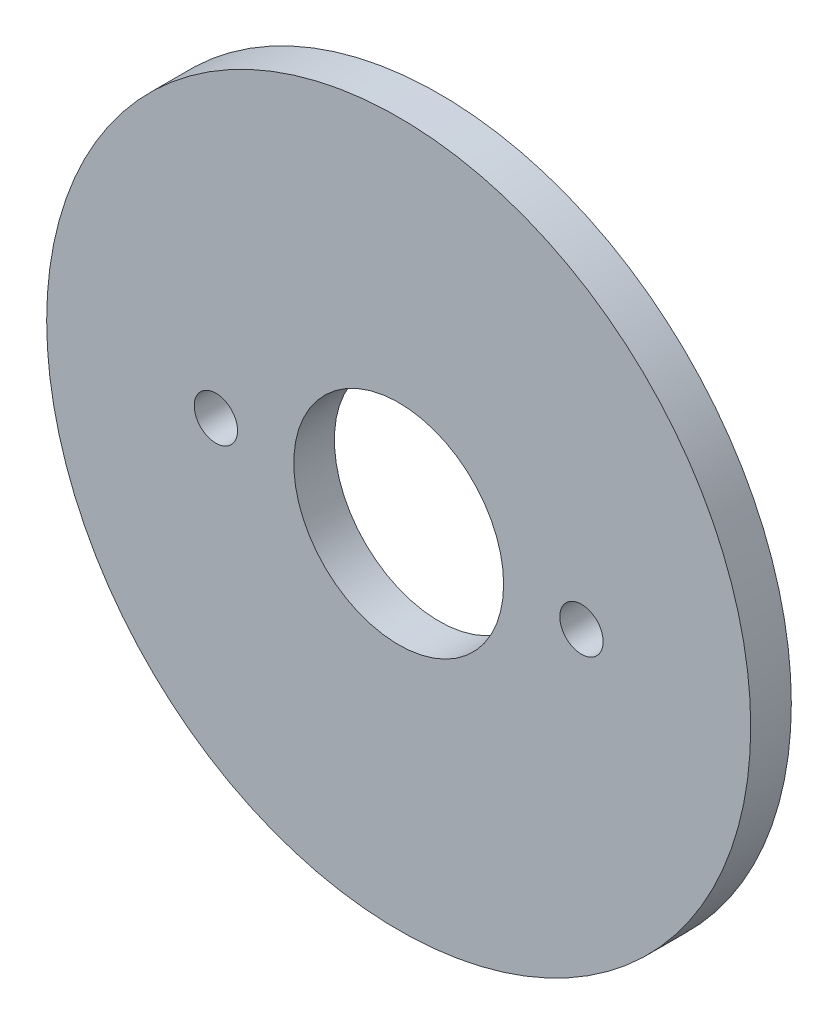
ISO-10303-21;
HEADER;
FILE_DESCRIPTION(('STEP AP214'),'2;1');
FILE_NAME('part.step','',(''),(''),'','','');
FILE_SCHEMA(('AUTOMOTIVE_DESIGN { 1 0 10303 214 1 1 1 1 }'));
ENDSEC;
DATA;
#1=APPLICATION_CONTEXT('core data for automotive mechanical design processes');
#2=APPLICATION_PROTOCOL_DEFINITION('international standard','automotive_design',2000,#1);
#3=PRODUCT_CONTEXT('',#1,'mechanical');
#4=PRODUCT('Part','Part','',(#3));
#5=PRODUCT_RELATED_PRODUCT_CATEGORY('part','',(#4));
#6=PRODUCT_DEFINITION_FORMATION('','',#4);
#7=PRODUCT_DEFINITION_CONTEXT('part definition',#1,'design');
#8=PRODUCT_DEFINITION('design','',#6,#7);
#9=PRODUCT_DEFINITION_SHAPE('','',#8);
#10=(LENGTH_UNIT() NAMED_UNIT(*) SI_UNIT(.MILLI.,.METRE.));
#11=(NAMED_UNIT(*) PLANE_ANGLE_UNIT() SI_UNIT($,.RADIAN.));
#12=(NAMED_UNIT(*) SI_UNIT($,.STERADIAN.) SOLID_ANGLE_UNIT());
#13=UNCERTAINTY_MEASURE_WITH_UNIT(LENGTH_MEASURE(1.E-05),#10,'distance_accuracy_value','');
#14=(GEOMETRIC_REPRESENTATION_CONTEXT(3) GLOBAL_UNCERTAINTY_ASSIGNED_CONTEXT((#13)) GLOBAL_UNIT_ASSIGNED_CONTEXT((#10,
#11,#12)) REPRESENTATION_CONTEXT('',''));
#15=CARTESIAN_POINT('',(0.,0.,0.));
#16=DIRECTION('',(0.,0.,1.));
#17=DIRECTION('',(1.,0.,0.));
#18=AXIS2_PLACEMENT_3D('',#15,#16,#17);
#19=CARTESIAN_POINT('',(0.,0.,1.5));
#20=DIRECTION('',(0.,0.,1.));
#21=DIRECTION('',(1.,0.,0.));
#22=AXIS2_PLACEMENT_3D('',#19,#20,#21);
#23=PLANE('',#22);
#24=CARTESIAN_POINT('',(-13.5,0.,1.5));
#25=DIRECTION('',(0.,0.,1.));
#26=DIRECTION('',(1.,0.,0.));
#27=AXIS2_PLACEMENT_3D('',#24,#25,#26);
#28=CIRCLE('',#27,1.6);
#29=CARTESIAN_POINT('',(-11.9,0.,1.5));
#30=VERTEX_POINT('',#29);
#31=EDGE_CURVE('E47',#30,#30,#28,.T.);
#32=ORIENTED_EDGE('',*,*,#31,.F.);
#33=EDGE_LOOP('',(#32));
#34=FACE_BOUND('',#33,.T.);
#35=CARTESIAN_POINT('',(0.,0.,1.5));
#36=DIRECTION('',(0.,0.,1.));
#37=DIRECTION('',(1.,0.,0.));
#38=AXIS2_PLACEMENT_3D('',#35,#36,#37);
#39=CIRCLE('',#38,26.);
#40=CARTESIAN_POINT('',(26.,0.,1.5));
#41=VERTEX_POINT('',#40);
#42=EDGE_CURVE('E10',#41,#41,#39,.T.);
#43=ORIENTED_EDGE('',*,*,#42,.T.);
#44=EDGE_LOOP('',(#43));
#45=FACE_BOUND('',#44,.T.);
#46=CARTESIAN_POINT('',(0.,0.,1.5));
#47=DIRECTION('',(0.,0.,1.));
#48=DIRECTION('',(1.,0.,0.));
#49=AXIS2_PLACEMENT_3D('',#46,#47,#48);
#50=CIRCLE('',#49,7.75);
#51=CARTESIAN_POINT('',(7.75,0.,1.5));
#52=VERTEX_POINT('',#51);
#53=EDGE_CURVE('E42',#52,#52,#50,.T.);
#54=ORIENTED_EDGE('',*,*,#53,.F.);
#55=EDGE_LOOP('',(#54));
#56=FACE_BOUND('',#55,.T.);
#57=CARTESIAN_POINT('',(13.5,0.,1.5));
#58=DIRECTION('',(0.,0.,1.));
#59=DIRECTION('',(1.,0.,0.));
#60=AXIS2_PLACEMENT_3D('',#57,#58,#59);
#61=CIRCLE('',#60,1.6);
#62=CARTESIAN_POINT('',(15.1,0.,1.5));
#63=VERTEX_POINT('',#62);
#64=EDGE_CURVE('E53',#63,#63,#61,.T.);
#65=ORIENTED_EDGE('',*,*,#64,.F.);
#66=EDGE_LOOP('',(#65));
#67=FACE_BOUND('',#66,.T.);
#68=ADVANCED_FACE('F31',(#34,#45,#56,#67),#23,.T.);
#69=CARTESIAN_POINT('',(0.,0.,-1.5));
#70=DIRECTION('',(0.,0.,1.));
#71=DIRECTION('',(1.,0.,0.));
#72=AXIS2_PLACEMENT_3D('',#69,#70,#71);
#73=PLANE('',#72);
#74=CARTESIAN_POINT('',(0.,0.,-1.5));
#75=DIRECTION('',(0.,0.,1.));
#76=DIRECTION('',(1.,0.,0.));
#77=AXIS2_PLACEMENT_3D('',#74,#75,#76);
#78=CIRCLE('',#77,26.);
#79=CARTESIAN_POINT('',(26.,0.,-1.5));
#80=VERTEX_POINT('',#79);
#81=EDGE_CURVE('E35',#80,#80,#78,.T.);
#82=ORIENTED_EDGE('',*,*,#81,.F.);
#83=EDGE_LOOP('',(#82));
#84=FACE_BOUND('',#83,.T.);
#85=CARTESIAN_POINT('',(0.,0.,-1.5));
#86=DIRECTION('',(0.,0.,1.));
#87=DIRECTION('',(1.,0.,0.));
#88=AXIS2_PLACEMENT_3D('',#85,#86,#87);
#89=CIRCLE('',#88,7.75);
#90=CARTESIAN_POINT('',(7.75,0.,-1.5));
#91=VERTEX_POINT('',#90);
#92=EDGE_CURVE('E44',#91,#91,#89,.T.);
#93=ORIENTED_EDGE('',*,*,#92,.T.);
#94=EDGE_LOOP('',(#93));
#95=FACE_BOUND('',#94,.T.);
#96=CARTESIAN_POINT('',(-13.5,0.,-1.5));
#97=DIRECTION('',(0.,0.,1.));
#98=DIRECTION('',(1.,0.,0.));
#99=AXIS2_PLACEMENT_3D('',#96,#97,#98);
#100=CIRCLE('',#99,1.6);
#101=CARTESIAN_POINT('',(-11.9,0.,-1.5));
#102=VERTEX_POINT('',#101);
#103=EDGE_CURVE('E50',#102,#102,#100,.T.);
#104=ORIENTED_EDGE('',*,*,#103,.T.);
#105=EDGE_LOOP('',(#104));
#106=FACE_BOUND('',#105,.T.);
#107=CARTESIAN_POINT('',(13.5,0.,-1.5));
#108=DIRECTION('',(0.,0.,1.));
#109=DIRECTION('',(1.,0.,0.));
#110=AXIS2_PLACEMENT_3D('',#107,#108,#109);
#111=CIRCLE('',#110,1.6);
#112=CARTESIAN_POINT('',(15.1,0.,-1.5));
#113=VERTEX_POINT('',#112);
#114=EDGE_CURVE('E56',#113,#113,#111,.T.);
#115=ORIENTED_EDGE('',*,*,#114,.T.);
#116=EDGE_LOOP('',(#115));
#117=FACE_BOUND('',#116,.T.);
#118=ADVANCED_FACE('F66',(#84,#95,#106,#117),#73,.F.);
#119=CARTESIAN_POINT('',(0.,0.,1.5));
#120=DIRECTION('',(0.,0.,-1.));
#121=DIRECTION('',(-1.,0.,0.));
#122=AXIS2_PLACEMENT_3D('',#119,#120,#121);
#123=CYLINDRICAL_SURFACE('',#122,26.);
#124=ORIENTED_EDGE('',*,*,#42,.F.);
#125=EDGE_LOOP('',(#124));
#126=FACE_BOUND('',#125,.T.);
#127=ORIENTED_EDGE('',*,*,#81,.T.);
#128=EDGE_LOOP('',(#127));
#129=FACE_BOUND('',#128,.T.);
#130=ADVANCED_FACE('F33',(#126,#129),#123,.T.);
#131=CARTESIAN_POINT('',(0.,0.,1.5));
#132=DIRECTION('',(0.,0.,-1.));
#133=DIRECTION('',(-1.,0.,0.));
#134=AXIS2_PLACEMENT_3D('',#131,#132,#133);
#135=CYLINDRICAL_SURFACE('',#134,7.75);
#136=ORIENTED_EDGE('',*,*,#53,.T.);
#137=EDGE_LOOP('',(#136));
#138=FACE_BOUND('',#137,.T.);
#139=ORIENTED_EDGE('',*,*,#92,.F.);
#140=EDGE_LOOP('',(#139));
#141=FACE_BOUND('',#140,.T.);
#142=ADVANCED_FACE('F75',(#138,#141),#135,.F.);
#143=CARTESIAN_POINT('',(-13.5,0.,1.5));
#144=DIRECTION('',(0.,0.,-1.));
#145=DIRECTION('',(-1.,0.,0.));
#146=AXIS2_PLACEMENT_3D('',#143,#144,#145);
#147=CYLINDRICAL_SURFACE('',#146,1.6);
#148=ORIENTED_EDGE('',*,*,#31,.T.);
#149=EDGE_LOOP('',(#148));
#150=FACE_BOUND('',#149,.T.);
#151=ORIENTED_EDGE('',*,*,#103,.F.);
#152=EDGE_LOOP('',(#151));
#153=FACE_BOUND('',#152,.T.);
#154=ADVANCED_FACE('F78',(#150,#153),#147,.F.);
#155=CARTESIAN_POINT('',(13.5,0.,1.5));
#156=DIRECTION('',(0.,0.,-1.));
#157=DIRECTION('',(-1.,0.,0.));
#158=AXIS2_PLACEMENT_3D('',#155,#156,#157);
#159=CYLINDRICAL_SURFACE('',#158,1.6);
#160=ORIENTED_EDGE('',*,*,#64,.T.);
#161=EDGE_LOOP('',(#160));
#162=FACE_BOUND('',#161,.T.);
#163=ORIENTED_EDGE('',*,*,#114,.F.);
#164=EDGE_LOOP('',(#163));
#165=FACE_BOUND('',#164,.T.);
#166=ADVANCED_FACE('F62',(#162,#165),#159,.F.);
#167=CLOSED_SHELL('',(#68,#118,#130,#142,#154,#166));
#168=MANIFOLD_SOLID_BREP('B2',#167);
#169=ADVANCED_BREP_SHAPE_REPRESENTATION('',(#18,#168),#14);
#170=SHAPE_DEFINITION_REPRESENTATION(#9,#169);
ENDSEC;
END-ISO-10303-21;
